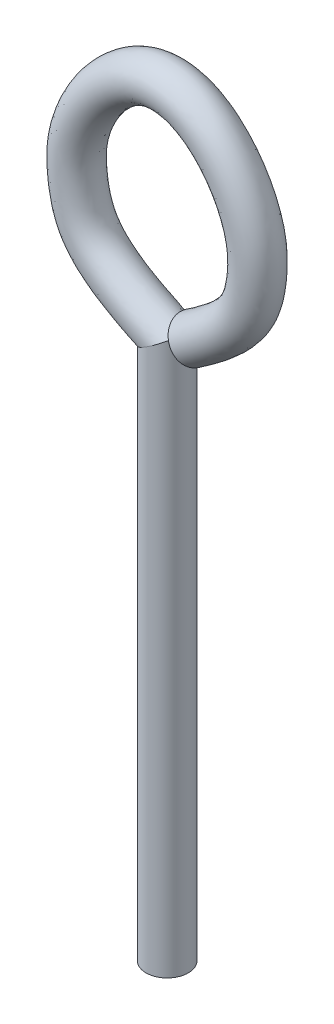
ISO-10303-21;
HEADER;
FILE_DESCRIPTION(('STEP AP214'),'2;1');
FILE_NAME('part.step','',(''),(''),'','','');
FILE_SCHEMA(('AUTOMOTIVE_DESIGN { 1 0 10303 214 1 1 1 1 }'));
ENDSEC;
DATA;
#1=APPLICATION_CONTEXT('core data for automotive mechanical design processes');
#2=APPLICATION_PROTOCOL_DEFINITION('international standard','automotive_design',2000,#1);
#3=PRODUCT_CONTEXT('',#1,'mechanical');
#4=PRODUCT('Part','Part','',(#3));
#5=PRODUCT_RELATED_PRODUCT_CATEGORY('part','',(#4));
#6=PRODUCT_DEFINITION_FORMATION('','',#4);
#7=PRODUCT_DEFINITION_CONTEXT('part definition',#1,'design');
#8=PRODUCT_DEFINITION('design','',#6,#7);
#9=PRODUCT_DEFINITION_SHAPE('','',#8);
#10=(LENGTH_UNIT() NAMED_UNIT(*) SI_UNIT(.MILLI.,.METRE.));
#11=(NAMED_UNIT(*) PLANE_ANGLE_UNIT() SI_UNIT($,.RADIAN.));
#12=(NAMED_UNIT(*) SI_UNIT($,.STERADIAN.) SOLID_ANGLE_UNIT());
#13=UNCERTAINTY_MEASURE_WITH_UNIT(LENGTH_MEASURE(1.E-05),#10,'distance_accuracy_value','');
#14=(GEOMETRIC_REPRESENTATION_CONTEXT(3) GLOBAL_UNCERTAINTY_ASSIGNED_CONTEXT((#13)) GLOBAL_UNIT_ASSIGNED_CONTEXT((#10,
#11,#12)) REPRESENTATION_CONTEXT('',''));
#15=CARTESIAN_POINT('',(0.,0.,0.));
#16=DIRECTION('',(0.,0.,1.));
#17=DIRECTION('',(1.,0.,0.));
#18=AXIS2_PLACEMENT_3D('',#15,#16,#17);
#19=CARTESIAN_POINT('',(0.,49.9497474683058,0.));
#20=DIRECTION('',(0.,-1.,0.));
#21=DIRECTION('',(0.,0.,-1.));
#22=AXIS2_PLACEMENT_3D('',#19,#20,#21);
#23=CYLINDRICAL_SURFACE('',#22,1.75);
#24=CARTESIAN_POINT('',(0.,0.,0.));
#25=DIRECTION('',(0.,1.,0.));
#26=DIRECTION('',(0.,0.,1.));
#27=AXIS2_PLACEMENT_3D('',#24,#25,#26);
#28=CIRCLE('',#27,1.75);
#29=CARTESIAN_POINT('',(0.,0.,1.75));
#30=VERTEX_POINT('',#29);
#31=EDGE_CURVE('E37',#30,#30,#28,.T.);
#32=ORIENTED_EDGE('',*,*,#31,.T.);
#33=EDGE_LOOP('',(#32));
#34=FACE_BOUND('',#33,.T.);
#35=CARTESIAN_POINT('',(0.,45.,0.));
#36=DIRECTION('',(-0.537515879175045,0.843253627110301,0.));
#37=DIRECTION('',(-0.843253627110301,-0.537515879175045,0.));
#38=AXIS2_PLACEMENT_3D('',#35,#36,#37);
#39=ELLIPSE('',#38,2.07529495722061,1.75);
#40=CARTESIAN_POINT('',(-1.75,43.884496006522,0.));
#41=VERTEX_POINT('',#40);
#42=EDGE_CURVE('E10',#41,#41,#39,.T.);
#43=ORIENTED_EDGE('',*,*,#42,.F.);
#44=EDGE_LOOP('',(#43));
#45=FACE_BOUND('',#44,.T.);
#46=ADVANCED_FACE('F31',(#34,#45),#23,.T.);
#47=CARTESIAN_POINT('',(0.,0.,0.));
#48=DIRECTION('',(0.,1.,0.));
#49=DIRECTION('',(0.,0.,1.));
#50=AXIS2_PLACEMENT_3D('',#47,#48,#49);
#51=PLANE('',#50);
#52=ORIENTED_EDGE('',*,*,#31,.F.);
#53=EDGE_LOOP('',(#52));
#54=FACE_BOUND('',#53,.T.);
#55=ADVANCED_FACE('F52',(#54),#51,.F.);
#56=CARTESIAN_POINT('',(1.10027891895064,47.2258342591642,0.));
#57=DIRECTION('',(0.82485233694895,0.565348230942538,0.));
#58=DIRECTION('',(-0.565348230942538,0.82485233694895,0.));
#59=AXIS2_PLACEMENT_3D('',#56,#57,#58);
#60=PLANE('',#59);
#61=CARTESIAN_POINT('',(2.08963832310007,45.7823426695035,0.));
#62=DIRECTION('',(0.824852336948949,0.565348230942538,0.));
#63=DIRECTION('',(-0.565348230942538,0.824852336948949,0.));
#64=AXIS2_PLACEMENT_3D('',#61,#62,#63);
#65=CIRCLE('',#64,1.75);
#66=CARTESIAN_POINT('',(1.10027891895063,47.2258342591642,0.));
#67=VERTEX_POINT('',#66);
#68=EDGE_CURVE('E41',#67,#67,#65,.T.);
#69=ORIENTED_EDGE('',*,*,#68,.F.);
#70=EDGE_LOOP('',(#69));
#71=FACE_BOUND('',#70,.T.);
#72=ADVANCED_FACE('F50',(#71),#60,.F.);
#73=CARTESIAN_POINT('',(-1.75,43.884496006522,0.));
#74=CARTESIAN_POINT('',(-2.59193497707647,44.2765711313591,0.));
#75=CARTESIAN_POINT('',(-4.12021981804194,45.0876388752744,0.));
#76=CARTESIAN_POINT('',(-6.15025959026306,46.4367333642148,0.));
#77=CARTESIAN_POINT('',(-7.6016461838136,47.9176053704359,0.));
#78=CARTESIAN_POINT('',(-8.48140276211655,49.4531043802861,0.));
#79=CARTESIAN_POINT('',(-8.96112125572907,50.9220122216512,0.));
#80=CARTESIAN_POINT('',(-9.19914345207512,52.4420332487437,0.));
#81=CARTESIAN_POINT('',(-9.31846671825026,53.9883232469989,0.));
#82=CARTESIAN_POINT('',(-9.19193674732248,55.8257869682266,0.));
#83=CARTESIAN_POINT('',(-8.59501980192239,57.7838437739616,0.));
#84=CARTESIAN_POINT('',(-7.69181991202202,59.6137152181275,0.));
#85=CARTESIAN_POINT('',(-6.50019446611266,61.3148822402637,0.));
#86=CARTESIAN_POINT('',(-5.05417938233967,62.8018529375566,0.));
#87=CARTESIAN_POINT('',(-3.48157116615469,63.8994072906003,0.));
#88=CARTESIAN_POINT('',(-1.8757297205832,64.5695999683235,0.));
#89=CARTESIAN_POINT('',(-0.294516827869267,64.8262596837808,0.));
#90=CARTESIAN_POINT('',(1.25512378935032,64.7083671945207,0.));
#91=CARTESIAN_POINT('',(2.7177237754251,64.2650268633497,0.));
#92=CARTESIAN_POINT('',(4.03060671213849,63.5646601452031,0.));
#93=CARTESIAN_POINT('',(5.38797270744053,62.5315249104751,0.));
#94=CARTESIAN_POINT('',(6.71246354203527,61.1040303743981,0.));
#95=CARTESIAN_POINT('',(7.88107017052304,59.3063416489442,0.));
#96=CARTESIAN_POINT('',(8.72989510482385,57.3885105504859,0.));
#97=CARTESIAN_POINT('',(9.23304766685604,55.4053477373251,0.));
#98=CARTESIAN_POINT('',(9.27789347938895,53.4742771293188,0.));
#99=CARTESIAN_POINT('',(9.10824705262887,51.9141743354323,0.));
#100=CARTESIAN_POINT('',(8.75639875850039,50.4126398944863,0.));
#101=CARTESIAN_POINT('',(8.11687384378676,48.9948432852989,0.));
#102=CARTESIAN_POINT('',(7.195162058902,47.7154288191016,0.));
#103=CARTESIAN_POINT('',(6.03894936541704,46.5596681981639,0.));
#104=CARTESIAN_POINT('',(4.65041960435741,45.4381711576744,0.));
#105=CARTESIAN_POINT('',(3.62376629738477,44.7122317852165,0.));
#106=CARTESIAN_POINT('',(3.07899772724951,44.3388510798429,0.));
#107=CARTESIAN_POINT('',(-1.75,43.884496006522,3.5));
#108=CARTESIAN_POINT('',(-2.52649223351015,44.2460955334186,3.5));
#109=CARTESIAN_POINT('',(-4.14463604651265,45.0990091070457,3.5));
#110=CARTESIAN_POINT('',(-6.14538294481069,46.4344623914834,3.5));
#111=CARTESIAN_POINT('',(-7.60242381983667,47.9179675026066,3.5));
#112=CARTESIAN_POINT('',(-8.48123326419899,49.4530254479232,3.5));
#113=CARTESIAN_POINT('',(-8.96116845915969,50.9220342035043,3.5));
#114=CARTESIAN_POINT('',(-9.19912912320753,52.4420265760282,3.5));
#115=CARTESIAN_POINT('',(-9.31847125545964,53.9883253599019,3.5));
#116=CARTESIAN_POINT('',(-9.1919353495036,55.8257863172856,3.5));
#117=CARTESIAN_POINT('',(-8.59502021225931,57.7838439650486,3.5));
#118=CARTESIAN_POINT('',(-7.69181979685052,59.6137151644941,3.5));
#119=CARTESIAN_POINT('',(-6.50019449698871,61.3148822546418,3.5));
#120=CARTESIAN_POINT('',(-5.05417937434645,62.8018529338354,3.5));
#121=CARTESIAN_POINT('',(-3.48157116761468,63.8994072912767,3.5));
#122=CARTESIAN_POINT('',(-1.87572972025302,64.5695999681785,3.5));
#123=CARTESIAN_POINT('',(-0.294516827979997,64.8262596838005,3.5));
#124=CARTESIAN_POINT('',(1.25512378947276,64.7083671945795,3.5));
#125=CARTESIAN_POINT('',(2.71772377504508,64.2650268630959,3.5));
#126=CARTESIAN_POINT('',(4.03060671355989,63.5646601461755,3.5));
#127=CARTESIAN_POINT('',(5.38797270079374,62.5315249059202,3.5));
#128=CARTESIAN_POINT('',(6.71246358226191,61.1040304019689,3.5));
#129=CARTESIAN_POINT('',(7.88107002163983,59.3063415469007,3.5));
#130=CARTESIAN_POINT('',(8.72989563583349,57.3885109144364,3.5));
#131=CARTESIAN_POINT('',(9.23304587244041,55.4053465074447,3.5));
#132=CARTESIAN_POINT('',(9.27789921999868,53.474281063894,3.5));
#133=CARTESIAN_POINT('',(9.10822924717027,51.914162131691,3.5));
#134=CARTESIAN_POINT('',(8.75645639613794,50.4126793989345,3.5));
#135=CARTESIAN_POINT('',(8.11666602754458,48.9947008494474,3.5));
#136=CARTESIAN_POINT('',(7.19600937303152,47.7160095624938,3.5));
#137=CARTESIAN_POINT('',(6.0351163671398,46.5570410869851,3.5));
#138=CARTESIAN_POINT('',(4.66887789804736,45.4508223477315,3.5));
#139=CARTESIAN_POINT('',(3.57607097078539,44.6795417299068,3.5));
#140=CARTESIAN_POINT('',(3.07899772724952,44.3388510798429,3.5));
#141=CARTESIAN_POINT('',(1.75,46.115503993478,3.5));
#142=CARTESIAN_POINT('',(0.973507766489843,46.4771035203746,3.5));
#143=CARTESIAN_POINT('',(-0.607253918580702,47.1820007881043,3.5));
#144=CARTESIAN_POINT('',(-2.45932523430682,48.1719445544805,3.5));
#145=CARTESIAN_POINT('',(-3.68476595672673,48.9613072217668,3.5));
#146=CARTESIAN_POINT('',(-4.48648155392828,49.6517740960046,3.5));
#147=CARTESIAN_POINT('',(-5.04248095791396,50.3788906567031,3.5));
#148=CARTESIAN_POINT('',(-5.45035334062405,51.3456744883818,3.5));
#149=CARTESIAN_POINT('',(-5.69238849907173,52.6329256622453,3.5));
#150=CARTESIAN_POINT('',(-5.84059243655457,53.9124508285814,3.49999999999999));
#151=CARTESIAN_POINT('',(-5.72620543750176,55.2554484321305,3.5));
#152=CARTESIAN_POINT('',(-5.23544337675106,56.7333461962158,3.5));
#153=CARTESIAN_POINT('',(-4.48206284474984,58.1410423365695,3.5));
#154=CARTESIAN_POINT('',(-3.53193971230027,59.3864924574623,3.5));
#155=CARTESIAN_POINT('',(-2.56804595224652,60.2896859834679,3.5));
#156=CARTESIAN_POINT('',(-1.67227841798423,60.8727603911423,3.5));
#157=CARTESIAN_POINT('',(-0.929326640038907,61.1941223191931,3.5));
#158=CARTESIAN_POINT('',(-0.126384218071411,61.316686679895,3.5));
#159=CARTESIAN_POINT('',(0.691591799534284,61.2412551531061,3.5));
#160=CARTESIAN_POINT('',(1.53295233991877,60.9507435358354,3.5));
#161=CARTESIAN_POINT('',(2.51324423314832,60.3673507151474,3.5));
#162=CARTESIAN_POINT('',(3.5390915116071,59.4293635200743,3.5));
#163=CARTESIAN_POINT('',(4.5126454210231,58.1207961351752,3.5));
#164=CARTESIAN_POINT('',(5.23764610860224,56.6929362016748,3.5));
#165=CARTESIAN_POINT('',(5.67102380437022,55.310574351671,3.5));
#166=CARTESIAN_POINT('',(5.78983515167942,54.0765415206986,3.5));
#167=CARTESIAN_POINT('',(5.68851502361793,52.7741482400102,3.5));
#168=CARTESIAN_POINT('',(5.4925877922784,51.764716101186,3.5));
#169=CARTESIAN_POINT('',(5.17049720218404,50.9393894958487,3.5));
#170=CARTESIAN_POINT('',(4.64683202356027,50.1408209247847,3.5));
#171=CARTESIAN_POINT('',(3.80557965137296,49.2631070240544,3.5));
#172=CARTESIAN_POINT('',(2.61946946496963,48.2899145112132,3.5));
#173=CARTESIAN_POINT('',(1.59735216248651,47.5665249092281,3.5));
#174=CARTESIAN_POINT('',(1.10027891895064,47.2258342591642,3.5));
#175=CARTESIAN_POINT('',(1.75,46.115503993478,0.));
#176=CARTESIAN_POINT('',(0.940786394706684,46.4923413193448,0.));
#177=CARTESIAN_POINT('',(-0.595045804345326,47.1763156722187,0.));
#178=CARTESIAN_POINT('',(-2.46176355703304,48.1730800408462,0.));
#179=CARTESIAN_POINT('',(-3.68437713871519,48.9611261556815,0.));
#180=CARTESIAN_POINT('',(-4.48656630288707,49.6518135621861,0.));
#181=CARTESIAN_POINT('',(-5.04245735619866,50.3788796657765,0.));
#182=CARTESIAN_POINT('',(-5.45036050505785,51.3456778247395,0.));
#183=CARTESIAN_POINT('',(-5.69238623046705,52.6329246057938,0.));
#184=CARTESIAN_POINT('',(-5.84059313546399,53.9124511540519,0.));
#185=CARTESIAN_POINT('',(-5.72620523233331,55.255448336587,0.));
#186=CARTESIAN_POINT('',(-5.2354434343368,56.7333462230325,0.));
#187=CARTESIAN_POINT('',(-4.48206282931182,58.1410423293804,0.));
#188=CARTESIAN_POINT('',(-3.53193971629689,59.3864924593229,0.));
#189=CARTESIAN_POINT('',(-2.56804595151652,60.2896859831297,0.));
#190=CARTESIAN_POINT('',(-1.67227841814932,60.8727603912147,0.));
#191=CARTESIAN_POINT('',(-0.929326639983543,61.1941223191832,0.));
#192=CARTESIAN_POINT('',(-0.126384218132629,61.3166866798657,0.));
#193=CARTESIAN_POINT('',(0.691591799724302,61.241255153233,0.));
#194=CARTESIAN_POINT('',(1.53295233920807,60.9507435353492,0.));
#195=CARTESIAN_POINT('',(2.51324423647171,60.3673507174248,0.));
#196=CARTESIAN_POINT('',(3.53909149149379,59.4293635062889,0.));
#197=CARTESIAN_POINT('',(4.51264549546471,58.120796186197,0.));
#198=CARTESIAN_POINT('',(5.23764584309742,56.6929360196995,0.));
#199=CARTESIAN_POINT('',(5.67102470157803,55.3105749666112,0.));
#200=CARTESIAN_POINT('',(5.78983228137456,54.076539553411,0.));
#201=CARTESIAN_POINT('',(5.68852392634724,52.7741543418808,0.));
#202=CARTESIAN_POINT('',(5.49255897345961,51.7646963489619,0.));
#203=CARTESIAN_POINT('',(5.17060111030514,50.9394607137744,0.));
#204=CARTESIAN_POINT('',(4.64640836649551,50.1405305530887,0.));
#205=CARTESIAN_POINT('',(3.80749615051158,49.2644205796438,0.));
#206=CARTESIAN_POINT('',(2.61024031812465,48.2835889161847,0.));
#207=CARTESIAN_POINT('',(1.6211998257862,47.5828699368829,0.));
#208=CARTESIAN_POINT('',(1.10027891895064,47.2258342591642,0.));
#209=CARTESIAN_POINT('',(1.75,46.115503993478,-3.5));
#210=CARTESIAN_POINT('',(0.908065022923525,46.5075791183151,-3.5));
#211=CARTESIAN_POINT('',(-0.582837690109983,47.170630556333,-3.5));
#212=CARTESIAN_POINT('',(-2.46420187975922,48.1742155272119,-3.5));
#213=CARTESIAN_POINT('',(-3.68398832070365,48.9609450895961,-3.5));
#214=CARTESIAN_POINT('',(-4.48665105184585,49.6518530283676,-3.5));
#215=CARTESIAN_POINT('',(-5.04243375448335,50.37886867485,-3.5));
#216=CARTESIAN_POINT('',(-5.45036766949165,51.3456811610973,-3.5));
#217=CARTESIAN_POINT('',(-5.69238396186234,52.6329235493423,-3.5));
#218=CARTESIAN_POINT('',(-5.84059383437344,53.9124514795224,-3.5));
#219=CARTESIAN_POINT('',(-5.72620502716484,55.2554482410435,-3.5));
#220=CARTESIAN_POINT('',(-5.23544349192255,56.7333462498491,-3.5));
#221=CARTESIAN_POINT('',(-4.4820628138738,58.1410423221913,-3.5));
#222=CARTESIAN_POINT('',(-3.5319397202935,59.3864924611835,-3.5));
#223=CARTESIAN_POINT('',(-2.56804595078653,60.2896859827915,-3.5));
#224=CARTESIAN_POINT('',(-1.67227841831441,60.8727603912872,-3.5));
#225=CARTESIAN_POINT('',(-0.929326639928171,61.1941223191734,-3.5));
#226=CARTESIAN_POINT('',(-0.126384218193861,61.3166866798363,-3.5));
#227=CARTESIAN_POINT('',(0.691591799914313,61.2412551533598,-3.5));
#228=CARTESIAN_POINT('',(1.53295233849738,60.950743534863,-3.5));
#229=CARTESIAN_POINT('',(2.51324423979511,60.3673507197023,-3.5));
#230=CARTESIAN_POINT('',(3.53909147138047,59.4293634925035,-3.5));
#231=CARTESIAN_POINT('',(4.5126455699063,58.1207962372187,-3.5));
#232=CARTESIAN_POINT('',(5.23764557759259,56.6929358377243,-3.5));
#233=CARTESIAN_POINT('',(5.67102559878585,55.3105755815513,-3.5));
#234=CARTESIAN_POINT('',(5.78982941106968,54.0765375861233,-3.5));
#235=CARTESIAN_POINT('',(5.68853282907654,52.7741604437514,-3.5));
#236=CARTESIAN_POINT('',(5.49253015464084,51.7646765967378,-3.5));
#237=CARTESIAN_POINT('',(5.17070501842622,50.9395319317,-3.5));
#238=CARTESIAN_POINT('',(4.64598470943076,50.1402401813926,-3.5));
#239=CARTESIAN_POINT('',(3.8094126496502,49.2657341352332,-3.5));
#240=CARTESIAN_POINT('',(2.60101117127968,48.2772633211561,-3.5));
#241=CARTESIAN_POINT('',(1.64504748908589,47.5992149645378,-3.5));
#242=CARTESIAN_POINT('',(1.10027891895064,47.2258342591642,-3.5));
#243=CARTESIAN_POINT('',(-1.75,43.884496006522,-3.5));
#244=CARTESIAN_POINT('',(-2.65737772064279,44.3070467292997,-3.5));
#245=CARTESIAN_POINT('',(-4.09580358957121,45.0762686435031,-3.5));
#246=CARTESIAN_POINT('',(-6.15513623571549,46.4390043369462,-3.5));
#247=CARTESIAN_POINT('',(-7.60086854779051,47.9172432382652,-3.5));
#248=CARTESIAN_POINT('',(-8.48157226003412,49.4531833126491,-3.5));
#249=CARTESIAN_POINT('',(-8.96107405229847,50.9219902397982,-3.5));
#250=CARTESIAN_POINT('',(-9.19915778094273,52.4420399214592,-3.5));
#251=CARTESIAN_POINT('',(-9.31846218104085,53.9883211340959,-3.5));
#252=CARTESIAN_POINT('',(-9.19193814514135,55.8257876191676,-3.49999999999999));
#253=CARTESIAN_POINT('',(-8.59501939158548,57.7838435828745,-3.5));
#254=CARTESIAN_POINT('',(-7.69182002719351,59.6137152717609,-3.5));
#255=CARTESIAN_POINT('',(-6.50019443523664,61.3148822258855,-3.5));
#256=CARTESIAN_POINT('',(-5.0541793903329,62.8018529412779,-3.5));
#257=CARTESIAN_POINT('',(-3.4815711646947,63.8994072899238,-3.5));
#258=CARTESIAN_POINT('',(-1.87572972091337,64.5695999684684,-3.5));
#259=CARTESIAN_POINT('',(-0.294516827758527,64.8262596837611,-3.5));
#260=CARTESIAN_POINT('',(1.25512378922786,64.708367194462,-3.5));
#261=CARTESIAN_POINT('',(2.71772377580514,64.2650268636033,-3.5));
#262=CARTESIAN_POINT('',(4.03060671071711,63.5646601442308,-3.5));
#263=CARTESIAN_POINT('',(5.38797271408731,62.5315249150299,-3.5));
#264=CARTESIAN_POINT('',(6.71246350180864,61.1040303468273,-3.5));
#265=CARTESIAN_POINT('',(7.88107031940623,59.3063417509877,-3.5));
#266=CARTESIAN_POINT('',(8.7298945738142,57.3885101865355,-3.5));
#267=CARTESIAN_POINT('',(9.23304946127168,55.4053489672054,-3.5));
#268=CARTESIAN_POINT('',(9.2778877387792,53.4742731947435,-3.5));
#269=CARTESIAN_POINT('',(9.1082648580875,51.9141865391736,-3.5));
#270=CARTESIAN_POINT('',(8.75634112086282,50.4126003900381,-3.5));
#271=CARTESIAN_POINT('',(8.11708166002894,48.9949857211502,-3.5));
#272=CARTESIAN_POINT('',(7.19431474477249,47.7148480757095,-3.5));
#273=CARTESIAN_POINT('',(6.04278236369428,46.5622953093427,-3.5));
#274=CARTESIAN_POINT('',(4.63196131066747,45.4255199676172,-3.5));
#275=CARTESIAN_POINT('',(3.67146162398415,44.7449218405262,-3.5));
#276=CARTESIAN_POINT('',(3.07899772724952,44.3388510798429,-3.5));
#277=CARTESIAN_POINT('',(-1.75,43.884496006522,0.));
#278=CARTESIAN_POINT('',(-2.59193497707647,44.2765711313591,0.));
#279=CARTESIAN_POINT('',(-4.12021981804194,45.0876388752744,0.));
#280=CARTESIAN_POINT('',(-6.15025959026306,46.4367333642148,0.));
#281=CARTESIAN_POINT('',(-7.6016461838136,47.9176053704359,0.));
#282=CARTESIAN_POINT('',(-8.48140276211655,49.4531043802861,0.));
#283=CARTESIAN_POINT('',(-8.96112125572907,50.9220122216512,0.));
#284=CARTESIAN_POINT('',(-9.19914345207512,52.4420332487437,0.));
#285=CARTESIAN_POINT('',(-9.31846671825026,53.9883232469989,0.));
#286=CARTESIAN_POINT('',(-9.19193674732248,55.8257869682266,0.));
#287=CARTESIAN_POINT('',(-8.59501980192239,57.7838437739616,0.));
#288=CARTESIAN_POINT('',(-7.69181991202202,59.6137152181275,0.));
#289=CARTESIAN_POINT('',(-6.50019446611266,61.3148822402637,0.));
#290=CARTESIAN_POINT('',(-5.05417938233967,62.8018529375566,0.));
#291=CARTESIAN_POINT('',(-3.48157116615469,63.8994072906003,0.));
#292=CARTESIAN_POINT('',(-1.8757297205832,64.5695999683235,0.));
#293=CARTESIAN_POINT('',(-0.294516827869267,64.8262596837808,0.));
#294=CARTESIAN_POINT('',(1.25512378935032,64.7083671945207,0.));
#295=CARTESIAN_POINT('',(2.7177237754251,64.2650268633497,0.));
#296=CARTESIAN_POINT('',(4.03060671213849,63.5646601452031,0.));
#297=CARTESIAN_POINT('',(5.38797270744053,62.5315249104751,0.));
#298=CARTESIAN_POINT('',(6.71246354203527,61.1040303743981,0.));
#299=CARTESIAN_POINT('',(7.88107017052304,59.3063416489442,0.));
#300=CARTESIAN_POINT('',(8.72989510482385,57.3885105504859,0.));
#301=CARTESIAN_POINT('',(9.23304766685604,55.4053477373251,0.));
#302=CARTESIAN_POINT('',(9.27789347938895,53.4742771293188,0.));
#303=CARTESIAN_POINT('',(9.10824705262887,51.9141743354323,0.));
#304=CARTESIAN_POINT('',(8.75639875850039,50.4126398944863,0.));
#305=CARTESIAN_POINT('',(8.11687384378676,48.9948432852989,0.));
#306=CARTESIAN_POINT('',(7.195162058902,47.7154288191016,0.));
#307=CARTESIAN_POINT('',(6.03894936541704,46.5596681981639,0.));
#308=CARTESIAN_POINT('',(4.65041960435741,45.4381711576744,0.));
#309=CARTESIAN_POINT('',(3.62376629738477,44.7122317852165,0.));
#310=CARTESIAN_POINT('',(3.07899772724951,44.3388510798429,0.));
#311=(BOUNDED_SURFACE() B_SPLINE_SURFACE(3,3,((#73,#74,#75,#76,#77,#78,#79,#80,#81,#82,#83,#84,
#85,#86,#87,#88,#89,#90,#91,#92,#93,#94,#95,#96,#97,#98,#99,#100,#101,#102,#103,#104,#105,#106),
(#107,#108,#109,#110,#111,#112,#113,#114,#115,#116,#117,#118,#119,#120,#121,#122,#123,#124,#125,
#126,#127,#128,#129,#130,#131,#132,#133,#134,#135,#136,#137,#138,#139,#140),(#141,#142,#143,
#144,#145,#146,#147,#148,#149,#150,#151,#152,#153,#154,#155,#156,#157,#158,#159,#160,#161,#162,
#163,#164,#165,#166,#167,#168,#169,#170,#171,#172,#173,#174),(#175,#176,#177,#178,#179,#180,
#181,#182,#183,#184,#185,#186,#187,#188,#189,#190,#191,#192,#193,#194,#195,#196,#197,#198,#199,
#200,#201,#202,#203,#204,#205,#206,#207,#208),(#209,#210,#211,#212,#213,#214,#215,#216,#217,
#218,#219,#220,#221,#222,#223,#224,#225,#226,#227,#228,#229,#230,#231,#232,#233,#234,#235,#236,
#237,#238,#239,#240,#241,#242),(#243,#244,#245,#246,#247,#248,#249,#250,#251,#252,#253,#254,
#255,#256,#257,#258,#259,#260,#261,#262,#263,#264,#265,#266,#267,#268,#269,#270,#271,#272,#273,
#274,#275,#276),(#277,#278,#279,#280,#281,#282,#283,#284,#285,#286,#287,#288,#289,#290,#291,
#292,#293,#294,#295,#296,#297,#298,#299,#300,#301,#302,#303,#304,#305,#306,#307,#308,#309,
#310)),.UNSPECIFIED.,.T.,.F.,.F.) B_SPLINE_SURFACE_WITH_KNOTS((4,3,4),(4,1,1,1,1,1,1,1,1,1,1,1,
1,1,1,1,1,1,1,1,1,1,1,1,1,1,1,1,1,1,1,4),(0.,0.5,1.),(0.,0.0561891666980186,0.101352022698131,
0.138813918733385,0.164191880138055,0.189094075975628,0.215141800701855,0.243896060152358,
0.276201926897924,0.311356850701718,0.348368048810317,0.386204791035673,0.423675517459126,
0.459769550437018,0.485652816420339,0.510686124079794,0.535157041607124,0.559470944571645,
0.58396384661101,0.608935199475722,0.647341048054797,0.686226672446818,0.72438567806806,
0.76049478373231,0.793371781723016,0.822308808878346,0.848130298155526,0.872748335209942,
0.898231600571945,0.9266750771573,0.960024700435631,1.),
.UNSPECIFIED.) GEOMETRIC_REPRESENTATION_ITEM() RATIONAL_B_SPLINE_SURFACE(((1.,1.,1.,1.,1.,1.,1.,
1.,1.,1.,1.,1.,1.,1.,1.,1.,0.999999999999999,1.,1.,1.,1.,1.,1.,1.,1.,1.,1.,1.,1.,1.,1.,1.,1.,
1.),(0.333333333333333,0.333333333333333,0.333333333333333,0.333333333333333,0.333333333333333,
0.333333333333333,0.333333333333333,0.333333333333333,0.333333333333333,0.333333333333333,
0.333333333333333,0.333333333333333,0.333333333333333,0.333333333333333,0.333333333333333,
0.333333333333333,0.333333333333333,0.333333333333333,0.333333333333333,0.333333333333333,
0.333333333333333,0.333333333333333,0.333333333333333,0.333333333333333,0.333333333333333,
0.333333333333333,0.333333333333333,0.333333333333333,0.333333333333333,0.333333333333333,
0.333333333333333,0.333333333333333,0.333333333333333,0.333333333333333),(0.333333333333333,
0.333333333333333,0.333333333333333,0.333333333333333,0.333333333333333,0.333333333333333,
0.333333333333333,0.333333333333333,0.333333333333333,0.333333333333333,0.333333333333333,
0.333333333333333,0.333333333333333,0.333333333333333,0.333333333333333,0.333333333333333,
0.333333333333333,0.333333333333333,0.333333333333333,0.333333333333333,0.333333333333333,
0.333333333333333,0.333333333333333,0.333333333333333,0.333333333333333,0.333333333333333,
0.333333333333333,0.333333333333333,0.333333333333333,0.333333333333333,0.333333333333333,
0.333333333333333,0.333333333333333,0.333333333333333),(1.,1.,1.,1.,1.,1.,1.,1.,1.,1.,1.,1.,1.,
1.,1.,1.,0.999999999999999,1.,1.,1.,1.,1.,1.,1.,1.,1.,1.,1.,1.,1.,1.,1.,1.,1.),
(0.333333333333333,0.333333333333333,0.333333333333333,0.333333333333333,0.333333333333333,
0.333333333333333,0.333333333333333,0.333333333333333,0.333333333333333,0.333333333333333,
0.333333333333333,0.333333333333333,0.333333333333333,0.333333333333333,0.333333333333333,
0.333333333333333,0.333333333333333,0.333333333333333,0.333333333333333,0.333333333333333,
0.333333333333333,0.333333333333333,0.333333333333333,0.333333333333333,0.333333333333333,
0.333333333333333,0.333333333333333,0.333333333333333,0.333333333333333,0.333333333333333,
0.333333333333333,0.333333333333333,0.333333333333333,0.333333333333333),(0.333333333333333,
0.333333333333333,0.333333333333333,0.333333333333333,0.333333333333333,0.333333333333333,
0.333333333333333,0.333333333333333,0.333333333333333,0.333333333333333,0.333333333333333,
0.333333333333333,0.333333333333333,0.333333333333333,0.333333333333333,0.333333333333333,
0.333333333333333,0.333333333333333,0.333333333333333,0.333333333333333,0.333333333333333,
0.333333333333333,0.333333333333333,0.333333333333333,0.333333333333333,0.333333333333333,
0.333333333333333,0.333333333333333,0.333333333333333,0.333333333333333,0.333333333333333,
0.333333333333333,0.333333333333333,0.333333333333333),(1.,1.,1.,1.,1.,1.,1.,1.,1.,1.,1.,1.,1.,
1.,1.,1.,0.999999999999999,1.,1.,1.,1.,1.,1.,1.,1.,1.,1.,1.,1.,1.,1.,1.,1.,1.))) REPRESENTATION_ITEM('') SURFACE());
#312=ORIENTED_EDGE('',*,*,#42,.T.);
#313=EDGE_LOOP('',(#312));
#314=FACE_BOUND('',#313,.T.);
#315=ORIENTED_EDGE('',*,*,#68,.T.);
#316=EDGE_LOOP('',(#315));
#317=FACE_BOUND('',#316,.T.);
#318=ADVANCED_FACE('F48',(#314,#317),#311,.T.);
#319=CLOSED_SHELL('',(#46,#55,#72,#318));
#320=MANIFOLD_SOLID_BREP('B2',#319);
#321=ADVANCED_BREP_SHAPE_REPRESENTATION('',(#18,#320),#14);
#322=SHAPE_DEFINITION_REPRESENTATION(#9,#321);
ENDSEC;
END-ISO-10303-21;
